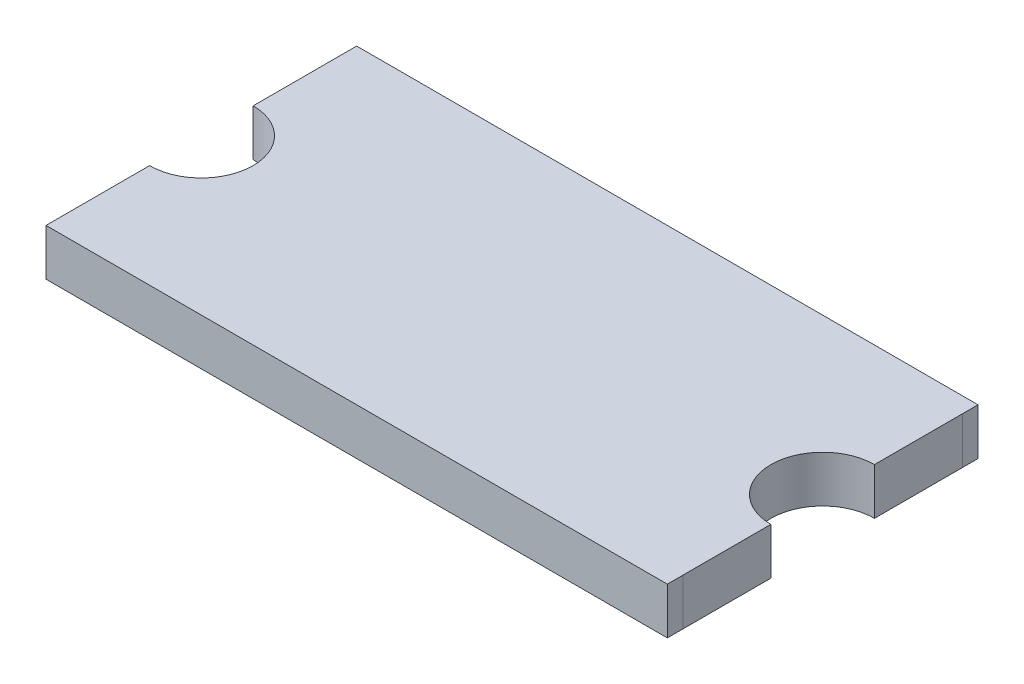
ISO-10303-21;
HEADER;
FILE_DESCRIPTION(('STEP AP214'),'2;1');
FILE_NAME('part.step','',(''),(''),'','','');
FILE_SCHEMA(('AUTOMOTIVE_DESIGN { 1 0 10303 214 1 1 1 1 }'));
ENDSEC;
DATA;
#1=APPLICATION_CONTEXT('core data for automotive mechanical design processes');
#2=APPLICATION_PROTOCOL_DEFINITION('international standard','automotive_design',2000,#1);
#3=PRODUCT_CONTEXT('',#1,'mechanical');
#4=PRODUCT('Part','Part','',(#3));
#5=PRODUCT_RELATED_PRODUCT_CATEGORY('part','',(#4));
#6=PRODUCT_DEFINITION_FORMATION('','',#4);
#7=PRODUCT_DEFINITION_CONTEXT('part definition',#1,'design');
#8=PRODUCT_DEFINITION('design','',#6,#7);
#9=PRODUCT_DEFINITION_SHAPE('','',#8);
#10=(LENGTH_UNIT() NAMED_UNIT(*) SI_UNIT(.MILLI.,.METRE.));
#11=(NAMED_UNIT(*) PLANE_ANGLE_UNIT() SI_UNIT($,.RADIAN.));
#12=(NAMED_UNIT(*) SI_UNIT($,.STERADIAN.) SOLID_ANGLE_UNIT());
#13=UNCERTAINTY_MEASURE_WITH_UNIT(LENGTH_MEASURE(1.E-05),#10,'distance_accuracy_value','');
#14=(GEOMETRIC_REPRESENTATION_CONTEXT(3) GLOBAL_UNCERTAINTY_ASSIGNED_CONTEXT((#13)) GLOBAL_UNIT_ASSIGNED_CONTEXT((#10,
#11,#12)) REPRESENTATION_CONTEXT('',''));
#15=CARTESIAN_POINT('',(0.,0.,0.));
#16=DIRECTION('',(0.,0.,1.));
#17=DIRECTION('',(1.,0.,0.));
#18=AXIS2_PLACEMENT_3D('',#15,#16,#17);
#19=CARTESIAN_POINT('',(0.,0.,0.));
#20=DIRECTION('',(0.,1.,0.));
#21=DIRECTION('',(1.,0.,0.));
#22=AXIS2_PLACEMENT_3D('',#19,#20,#21);
#23=PLANE('',#22);
#24=DIRECTION('',(0.,0.,1.));
#25=VECTOR('',#24,1.);
#26=CARTESIAN_POINT('',(0.,0.,0.1));
#27=LINE('',#26,#25);
#28=CARTESIAN_POINT('',(0.,0.,0.1));
#29=VERTEX_POINT('',#28);
#30=CARTESIAN_POINT('',(0.,0.,0.2));
#31=VERTEX_POINT('',#30);
#32=EDGE_CURVE('E333',#29,#31,#27,.T.);
#33=ORIENTED_EDGE('',*,*,#32,.T.);
#34=DIRECTION('',(-1.,0.,0.));
#35=VECTOR('',#34,1.);
#36=CARTESIAN_POINT('',(0.,0.,0.2));
#37=LINE('',#36,#35);
#38=CARTESIAN_POINT('',(-0.1,0.,0.2));
#39=VERTEX_POINT('',#38);
#40=EDGE_CURVE('E329',#31,#39,#37,.T.);
#41=ORIENTED_EDGE('',*,*,#40,.T.);
#42=DIRECTION('',(0.,0.,-1.));
#43=VECTOR('',#42,1.);
#44=CARTESIAN_POINT('',(-0.1,0.,0.2));
#45=LINE('',#44,#43);
#46=CARTESIAN_POINT('',(-0.1,0.,-0.2));
#47=VERTEX_POINT('',#46);
#48=EDGE_CURVE('E367',#39,#47,#45,.T.);
#49=ORIENTED_EDGE('',*,*,#48,.T.);
#50=DIRECTION('',(1.,0.,0.));
#51=VECTOR('',#50,1.);
#52=CARTESIAN_POINT('',(-0.1,0.,-0.2));
#53=LINE('',#52,#51);
#54=CARTESIAN_POINT('',(0.,0.,-0.2));
#55=VERTEX_POINT('',#54);
#56=EDGE_CURVE('E360',#47,#55,#53,.T.);
#57=ORIENTED_EDGE('',*,*,#56,.T.);
#58=DIRECTION('',(0.,0.,1.));
#59=VECTOR('',#58,1.);
#60=CARTESIAN_POINT('',(0.,0.,-0.2));
#61=LINE('',#60,#59);
#62=CARTESIAN_POINT('',(0.,0.,-0.1));
#63=VERTEX_POINT('',#62);
#64=EDGE_CURVE('E348',#55,#63,#61,.T.);
#65=ORIENTED_EDGE('',*,*,#64,.T.);
#66=DIRECTION('',(1.,0.,0.));
#67=VECTOR('',#66,1.);
#68=CARTESIAN_POINT('',(0.,0.,-0.1));
#69=LINE('',#68,#67);
#70=CARTESIAN_POINT('',(0.1,0.,-0.1));
#71=VERTEX_POINT('',#70);
#72=EDGE_CURVE('E345',#63,#71,#69,.T.);
#73=ORIENTED_EDGE('',*,*,#72,.T.);
#74=DIRECTION('',(0.,0.,1.));
#75=VECTOR('',#74,1.);
#76=CARTESIAN_POINT('',(0.1,0.,-0.1));
#77=LINE('',#76,#75);
#78=CARTESIAN_POINT('',(0.1,0.,0.1));
#79=VERTEX_POINT('',#78);
#80=EDGE_CURVE('E337',#71,#79,#77,.T.);
#81=ORIENTED_EDGE('',*,*,#80,.T.);
#82=DIRECTION('',(-1.,0.,0.));
#83=VECTOR('',#82,1.);
#84=CARTESIAN_POINT('',(0.1,0.,0.1));
#85=LINE('',#84,#83);
#86=EDGE_CURVE('E334',#79,#29,#85,.T.);
#87=ORIENTED_EDGE('',*,*,#86,.T.);
#88=EDGE_LOOP('',(#33,#41,#49,#57,#65,#73,#81,#87));
#89=FACE_BOUND('',#88,.T.);
#90=ADVANCED_FACE('F17',(#89),#23,.F.);
#91=CARTESIAN_POINT('',(0.,0.,0.));
#92=DIRECTION('',(0.,1.,0.));
#93=DIRECTION('',(1.,0.,0.));
#94=AXIS2_PLACEMENT_3D('',#91,#92,#93);
#95=PLANE('',#94);
#96=CARTESIAN_POINT('',(-0.500000810616883,0.,3.15918040491581E-06));
#97=DIRECTION('',(0.,-1.,0.));
#98=DIRECTION('',(0.481478331285645,0.,-0.876457994716456));
#99=AXIS2_PLACEMENT_3D('',#96,#97,#98);
#100=CIRCLE('',#99,0.225003159181865);
#101=CARTESIAN_POINT('',(-0.5,0.,-0.225));
#102=VERTEX_POINT('',#101);
#103=CARTESIAN_POINT('',(-0.391666665,0.,-0.197202658521));
#104=VERTEX_POINT('',#103);
#105=EDGE_CURVE('E379',#102,#104,#100,.T.);
#106=ORIENTED_EDGE('',*,*,#105,.F.);
#107=DIRECTION('',(0.,0.,1.));
#108=VECTOR('',#107,1.);
#109=CARTESIAN_POINT('',(-0.5,0.,-0.25));
#110=LINE('',#109,#108);
#111=CARTESIAN_POINT('',(-0.5,0.,-0.25));
#112=VERTEX_POINT('',#111);
#113=EDGE_CURVE('E11',#112,#102,#110,.T.);
#114=ORIENTED_EDGE('',*,*,#113,.F.);
#115=DIRECTION('',(-1.,0.,0.));
#116=VECTOR('',#115,1.);
#117=CARTESIAN_POINT('',(-0.391666665,0.,-0.25));
#118=LINE('',#117,#116);
#119=CARTESIAN_POINT('',(-0.391666665,0.,-0.25));
#120=VERTEX_POINT('',#119);
#121=EDGE_CURVE('E451',#120,#112,#118,.T.);
#122=ORIENTED_EDGE('',*,*,#121,.F.);
#123=DIRECTION('',(0.,0.,-1.));
#124=VECTOR('',#123,1.);
#125=CARTESIAN_POINT('',(-0.391666665,0.,-0.197202658521));
#126=LINE('',#125,#124);
#127=EDGE_CURVE('E357',#104,#120,#126,.T.);
#128=ORIENTED_EDGE('',*,*,#127,.F.);
#129=EDGE_LOOP('',(#106,#114,#122,#128));
#130=FACE_BOUND('',#129,.T.);
#131=ADVANCED_FACE('F740',(#130),#95,.F.);
#132=CARTESIAN_POINT('',(-0.5,0.075,0.25));
#133=DIRECTION('',(1.,0.,0.));
#134=DIRECTION('',(0.,1.,0.));
#135=AXIS2_PLACEMENT_3D('',#132,#133,#134);
#136=PLANE('',#135);
#137=DIRECTION('',(0.,-1.,0.));
#138=VECTOR('',#137,1.);
#139=CARTESIAN_POINT('',(-0.5,0.075,-0.225));
#140=LINE('',#139,#138);
#141=CARTESIAN_POINT('',(-0.5,0.075,-0.225));
#142=VERTEX_POINT('',#141);
#143=EDGE_CURVE('E25',#142,#102,#140,.T.);
#144=ORIENTED_EDGE('',*,*,#143,.F.);
#145=DIRECTION('',(0.,0.,1.));
#146=VECTOR('',#145,1.);
#147=CARTESIAN_POINT('',(-0.5,0.075,-0.25));
#148=LINE('',#147,#146);
#149=CARTESIAN_POINT('',(-0.5,0.075,-0.25));
#150=VERTEX_POINT('',#149);
#151=EDGE_CURVE('E349',#150,#142,#148,.T.);
#152=ORIENTED_EDGE('',*,*,#151,.F.);
#153=DIRECTION('',(0.,-1.,0.));
#154=VECTOR('',#153,1.);
#155=CARTESIAN_POINT('',(-0.5,0.075,-0.25));
#156=LINE('',#155,#154);
#157=EDGE_CURVE('E446',#150,#112,#156,.T.);
#158=ORIENTED_EDGE('',*,*,#157,.T.);
#159=ORIENTED_EDGE('',*,*,#113,.T.);
#160=EDGE_LOOP('',(#144,#152,#158,#159));
#161=FACE_BOUND('',#160,.T.);
#162=ADVANCED_FACE('F742',(#161),#136,.F.);
#163=CARTESIAN_POINT('',(-0.5,0.075,0.25));
#164=DIRECTION('',(1.,0.,0.));
#165=DIRECTION('',(0.,1.,0.));
#166=AXIS2_PLACEMENT_3D('',#163,#164,#165);
#167=PLANE('',#166);
#168=DIRECTION('',(0.,0.,1.));
#169=VECTOR('',#168,1.);
#170=CARTESIAN_POINT('',(-0.5,0.075,-0.225));
#171=LINE('',#170,#169);
#172=CARTESIAN_POINT('',(-0.5,0.075,-0.083333335));
#173=VERTEX_POINT('',#172);
#174=EDGE_CURVE('E353',#142,#173,#171,.T.);
#175=ORIENTED_EDGE('',*,*,#174,.F.);
#176=ORIENTED_EDGE('',*,*,#143,.T.);
#177=DIRECTION('',(0.,0.,1.));
#178=VECTOR('',#177,1.);
#179=CARTESIAN_POINT('',(-0.5,0.,-0.225));
#180=LINE('',#179,#178);
#181=CARTESIAN_POINT('',(-0.5,0.,-0.083333335));
#182=VERTEX_POINT('',#181);
#183=EDGE_CURVE('E319',#102,#182,#180,.T.);
#184=ORIENTED_EDGE('',*,*,#183,.T.);
#185=DIRECTION('',(0.,1.,0.));
#186=VECTOR('',#185,1.);
#187=CARTESIAN_POINT('',(-0.5,0.,-0.083333335));
#188=LINE('',#187,#186);
#189=EDGE_CURVE('E364',#182,#173,#188,.T.);
#190=ORIENTED_EDGE('',*,*,#189,.T.);
#191=EDGE_LOOP('',(#175,#176,#184,#190));
#192=FACE_BOUND('',#191,.T.);
#193=ADVANCED_FACE('F811',(#192),#167,.F.);
#194=CARTESIAN_POINT('',(-0.5,0.,0.));
#195=DIRECTION('',(0.,1.,0.));
#196=DIRECTION('',(0.,0.,1.));
#197=AXIS2_PLACEMENT_3D('',#194,#195,#196);
#198=CYLINDRICAL_SURFACE('',#197,0.083333335);
#199=CARTESIAN_POINT('',(-0.5,0.,0.));
#200=DIRECTION('',(0.,-1.,0.));
#201=DIRECTION('',(0.,0.,-1.));
#202=AXIS2_PLACEMENT_3D('',#199,#200,#201);
#203=CIRCLE('',#202,0.083333335);
#204=CARTESIAN_POINT('',(-0.5,0.,0.083333335));
#205=VERTEX_POINT('',#204);
#206=EDGE_CURVE('E315',#182,#205,#203,.T.);
#207=ORIENTED_EDGE('',*,*,#206,.T.);
#208=DIRECTION('',(0.,-1.,0.));
#209=VECTOR('',#208,1.);
#210=CARTESIAN_POINT('',(-0.5,0.075,0.083333335));
#211=LINE('',#210,#209);
#212=CARTESIAN_POINT('',(-0.5,0.075,0.083333335));
#213=VERTEX_POINT('',#212);
#214=EDGE_CURVE('E419',#213,#205,#211,.T.);
#215=ORIENTED_EDGE('',*,*,#214,.F.);
#216=CARTESIAN_POINT('',(-0.5,0.075,0.));
#217=DIRECTION('',(0.,1.,0.));
#218=DIRECTION('',(0.,0.,1.));
#219=AXIS2_PLACEMENT_3D('',#216,#217,#218);
#220=CIRCLE('',#219,0.083333335);
#221=EDGE_CURVE('E400',#213,#173,#220,.T.);
#222=ORIENTED_EDGE('',*,*,#221,.T.);
#223=ORIENTED_EDGE('',*,*,#189,.F.);
#224=EDGE_LOOP('',(#207,#215,#222,#223));
#225=FACE_BOUND('',#224,.T.);
#226=ADVANCED_FACE('F808',(#225),#198,.F.);
#227=CARTESIAN_POINT('',(-0.5,0.075,0.25));
#228=DIRECTION('',(1.,0.,0.));
#229=DIRECTION('',(0.,1.,0.));
#230=AXIS2_PLACEMENT_3D('',#227,#228,#229);
#231=PLANE('',#230);
#232=DIRECTION('',(0.,-1.,0.));
#233=VECTOR('',#232,1.);
#234=CARTESIAN_POINT('',(-0.5,0.075,0.225));
#235=LINE('',#234,#233);
#236=CARTESIAN_POINT('',(-0.5,0.075,0.225));
#237=VERTEX_POINT('',#236);
#238=CARTESIAN_POINT('',(-0.5,0.,0.225));
#239=VERTEX_POINT('',#238);
#240=EDGE_CURVE('E342',#237,#239,#235,.T.);
#241=ORIENTED_EDGE('',*,*,#240,.F.);
#242=DIRECTION('',(0.,0.,1.));
#243=VECTOR('',#242,1.);
#244=CARTESIAN_POINT('',(-0.5,0.075,0.083333335));
#245=LINE('',#244,#243);
#246=EDGE_CURVE('E314',#213,#237,#245,.T.);
#247=ORIENTED_EDGE('',*,*,#246,.F.);
#248=ORIENTED_EDGE('',*,*,#214,.T.);
#249=DIRECTION('',(0.,0.,1.));
#250=VECTOR('',#249,1.);
#251=CARTESIAN_POINT('',(-0.5,0.,0.083333335));
#252=LINE('',#251,#250);
#253=EDGE_CURVE('E320',#205,#239,#252,.T.);
#254=ORIENTED_EDGE('',*,*,#253,.T.);
#255=EDGE_LOOP('',(#241,#247,#248,#254));
#256=FACE_BOUND('',#255,.T.);
#257=ADVANCED_FACE('F800',(#256),#231,.F.);
#258=CARTESIAN_POINT('',(0.5,0.075,0.25));
#259=DIRECTION('',(-1.,0.,0.));
#260=DIRECTION('',(0.,0.,1.));
#261=AXIS2_PLACEMENT_3D('',#258,#259,#260);
#262=PLANE('',#261);
#263=DIRECTION('',(0.,1.,0.));
#264=VECTOR('',#263,1.);
#265=CARTESIAN_POINT('',(0.5,0.,-0.225));
#266=LINE('',#265,#264);
#267=CARTESIAN_POINT('',(0.5,0.,-0.225));
#268=VERTEX_POINT('',#267);
#269=CARTESIAN_POINT('',(0.5,0.075,-0.225));
#270=VERTEX_POINT('',#269);
#271=EDGE_CURVE('E417',#268,#270,#266,.T.);
#272=ORIENTED_EDGE('',*,*,#271,.F.);
#273=DIRECTION('',(0.,0.,-1.));
#274=VECTOR('',#273,1.);
#275=CARTESIAN_POINT('',(0.5,0.,-0.225));
#276=LINE('',#275,#274);
#277=CARTESIAN_POINT('',(0.5,0.,-0.25));
#278=VERTEX_POINT('',#277);
#279=EDGE_CURVE('E468',#268,#278,#276,.T.);
#280=ORIENTED_EDGE('',*,*,#279,.T.);
#281=DIRECTION('',(0.,-1.,0.));
#282=VECTOR('',#281,1.);
#283=CARTESIAN_POINT('',(0.5,0.075,-0.25));
#284=LINE('',#283,#282);
#285=CARTESIAN_POINT('',(0.5,0.075,-0.25));
#286=VERTEX_POINT('',#285);
#287=EDGE_CURVE('E469',#286,#278,#284,.T.);
#288=ORIENTED_EDGE('',*,*,#287,.F.);
#289=DIRECTION('',(0.,0.,-1.));
#290=VECTOR('',#289,1.);
#291=CARTESIAN_POINT('',(0.5,0.075,-0.225));
#292=LINE('',#291,#290);
#293=EDGE_CURVE('E354',#270,#286,#292,.T.);
#294=ORIENTED_EDGE('',*,*,#293,.F.);
#295=EDGE_LOOP('',(#272,#280,#288,#294));
#296=FACE_BOUND('',#295,.T.);
#297=ADVANCED_FACE('F744',(#296),#262,.F.);
#298=CARTESIAN_POINT('',(0.5,0.075,0.25));
#299=DIRECTION('',(-1.,0.,0.));
#300=DIRECTION('',(0.,0.,1.));
#301=AXIS2_PLACEMENT_3D('',#298,#299,#300);
#302=PLANE('',#301);
#303=DIRECTION('',(0.,0.,-1.));
#304=VECTOR('',#303,1.);
#305=CARTESIAN_POINT('',(0.5,0.,-0.083333335));
#306=LINE('',#305,#304);
#307=CARTESIAN_POINT('',(0.5,0.,-0.083333335));
#308=VERTEX_POINT('',#307);
#309=EDGE_CURVE('E464',#308,#268,#306,.T.);
#310=ORIENTED_EDGE('',*,*,#309,.T.);
#311=ORIENTED_EDGE('',*,*,#271,.T.);
#312=DIRECTION('',(0.,0.,-1.));
#313=VECTOR('',#312,1.);
#314=CARTESIAN_POINT('',(0.5,0.075,-0.083333335));
#315=LINE('',#314,#313);
#316=CARTESIAN_POINT('',(0.5,0.075,-0.083333335));
#317=VERTEX_POINT('',#316);
#318=EDGE_CURVE('E395',#317,#270,#315,.T.);
#319=ORIENTED_EDGE('',*,*,#318,.F.);
#320=DIRECTION('',(0.,-1.,0.));
#321=VECTOR('',#320,1.);
#322=CARTESIAN_POINT('',(0.5,0.075,-0.083333335));
#323=LINE('',#322,#321);
#324=EDGE_CURVE('E413',#317,#308,#323,.T.);
#325=ORIENTED_EDGE('',*,*,#324,.T.);
#326=EDGE_LOOP('',(#310,#311,#319,#325));
#327=FACE_BOUND('',#326,.T.);
#328=ADVANCED_FACE('F745',(#327),#302,.F.);
#329=CARTESIAN_POINT('',(0.5,0.075,0.25));
#330=DIRECTION('',(0.,0.,-1.));
#331=DIRECTION('',(0.,-1.,0.));
#332=AXIS2_PLACEMENT_3D('',#329,#330,#331);
#333=PLANE('',#332);
#334=DIRECTION('',(1.,0.,0.));
#335=VECTOR('',#334,1.);
#336=CARTESIAN_POINT('',(-0.5,0.,0.25));
#337=LINE('',#336,#335);
#338=CARTESIAN_POINT('',(-0.5,0.,0.25));
#339=VERTEX_POINT('',#338);
#340=CARTESIAN_POINT('',(-0.391666665,0.,0.25));
#341=VERTEX_POINT('',#340);
#342=EDGE_CURVE('E283',#339,#341,#337,.T.);
#343=ORIENTED_EDGE('',*,*,#342,.T.);
#344=DIRECTION('',(1.,0.,0.));
#345=VECTOR('',#344,1.);
#346=CARTESIAN_POINT('',(-0.391666665,0.,0.25));
#347=LINE('',#346,#345);
#348=CARTESIAN_POINT('',(-0.341666665,0.,0.25));
#349=VERTEX_POINT('',#348);
#350=EDGE_CURVE('E253',#341,#349,#347,.T.);
#351=ORIENTED_EDGE('',*,*,#350,.T.);
#352=DIRECTION('',(1.,0.,0.));
#353=VECTOR('',#352,1.);
#354=CARTESIAN_POINT('',(-0.341666665,0.,0.25));
#355=LINE('',#354,#353);
#356=CARTESIAN_POINT('',(0.341666665,0.,0.25));
#357=VERTEX_POINT('',#356);
#358=EDGE_CURVE('E246',#349,#357,#355,.T.);
#359=ORIENTED_EDGE('',*,*,#358,.T.);
#360=DIRECTION('',(1.,0.,0.));
#361=VECTOR('',#360,1.);
#362=CARTESIAN_POINT('',(0.341666665,0.,0.25));
#363=LINE('',#362,#361);
#364=CARTESIAN_POINT('',(0.391666665,0.,0.25));
#365=VERTEX_POINT('',#364);
#366=EDGE_CURVE('E250',#357,#365,#363,.T.);
#367=ORIENTED_EDGE('',*,*,#366,.T.);
#368=DIRECTION('',(1.,0.,0.));
#369=VECTOR('',#368,1.);
#370=CARTESIAN_POINT('',(0.391666665,0.,0.25));
#371=LINE('',#370,#369);
#372=CARTESIAN_POINT('',(0.5,0.,0.25));
#373=VERTEX_POINT('',#372);
#374=EDGE_CURVE('E37',#365,#373,#371,.T.);
#375=ORIENTED_EDGE('',*,*,#374,.T.);
#376=DIRECTION('',(0.,-1.,0.));
#377=VECTOR('',#376,1.);
#378=CARTESIAN_POINT('',(0.5,0.075,0.25));
#379=LINE('',#378,#377);
#380=CARTESIAN_POINT('',(0.5,0.075,0.25));
#381=VERTEX_POINT('',#380);
#382=EDGE_CURVE('E297',#381,#373,#379,.T.);
#383=ORIENTED_EDGE('',*,*,#382,.F.);
#384=DIRECTION('',(1.,0.,0.));
#385=VECTOR('',#384,1.);
#386=CARTESIAN_POINT('',(-0.5,0.075,0.25));
#387=LINE('',#386,#385);
#388=CARTESIAN_POINT('',(-0.5,0.075,0.25));
#389=VERTEX_POINT('',#388);
#390=EDGE_CURVE('E309',#389,#381,#387,.T.);
#391=ORIENTED_EDGE('',*,*,#390,.F.);
#392=DIRECTION('',(0.,-1.,0.));
#393=VECTOR('',#392,1.);
#394=CARTESIAN_POINT('',(-0.5,0.075,0.25));
#395=LINE('',#394,#393);
#396=EDGE_CURVE('E392',#389,#339,#395,.T.);
#397=ORIENTED_EDGE('',*,*,#396,.T.);
#398=EDGE_LOOP('',(#343,#351,#359,#367,#375,#383,#391,#397));
#399=FACE_BOUND('',#398,.T.);
#400=ADVANCED_FACE('F248',(#399),#333,.F.);
#401=CARTESIAN_POINT('',(0.,0.,0.));
#402=DIRECTION('',(0.,1.,0.));
#403=DIRECTION('',(1.,0.,0.));
#404=AXIS2_PLACEMENT_3D('',#401,#402,#403);
#405=PLANE('',#404);
#406=DIRECTION('',(0.,0.,1.));
#407=VECTOR('',#406,1.);
#408=CARTESIAN_POINT('',(0.391666665,0.,0.197202658521));
#409=LINE('',#408,#407);
#410=CARTESIAN_POINT('',(0.391666665,0.,0.197202658521));
#411=VERTEX_POINT('',#410);
#412=EDGE_CURVE('E271',#411,#365,#409,.T.);
#413=ORIENTED_EDGE('',*,*,#412,.F.);
#414=CARTESIAN_POINT('',(0.500000810616883,0.,-3.15918040491581E-06));
#415=DIRECTION('',(0.,-1.,0.));
#416=DIRECTION('',(-0.481478331285645,0.,0.876457994716456));
#417=AXIS2_PLACEMENT_3D('',#414,#415,#416);
#418=CIRCLE('',#417,0.225003159181865);
#419=CARTESIAN_POINT('',(0.5,0.,0.225));
#420=VERTEX_POINT('',#419);
#421=EDGE_CURVE('E278',#420,#411,#418,.T.);
#422=ORIENTED_EDGE('',*,*,#421,.F.);
#423=DIRECTION('',(0.,0.,-1.));
#424=VECTOR('',#423,1.);
#425=CARTESIAN_POINT('',(0.5,0.,0.25));
#426=LINE('',#425,#424);
#427=EDGE_CURVE('E300',#373,#420,#426,.T.);
#428=ORIENTED_EDGE('',*,*,#427,.F.);
#429=ORIENTED_EDGE('',*,*,#374,.F.);
#430=EDGE_LOOP('',(#413,#422,#428,#429));
#431=FACE_BOUND('',#430,.T.);
#432=ADVANCED_FACE('F512',(#431),#405,.F.);
#433=CARTESIAN_POINT('',(0.5,0.075,0.25));
#434=DIRECTION('',(-1.,0.,0.));
#435=DIRECTION('',(0.,0.,1.));
#436=AXIS2_PLACEMENT_3D('',#433,#434,#435);
#437=PLANE('',#436);
#438=ORIENTED_EDGE('',*,*,#427,.T.);
#439=DIRECTION('',(0.,1.,0.));
#440=VECTOR('',#439,1.);
#441=CARTESIAN_POINT('',(0.5,0.,0.225));
#442=LINE('',#441,#440);
#443=CARTESIAN_POINT('',(0.5,0.075,0.225));
#444=VERTEX_POINT('',#443);
#445=EDGE_CURVE('E47',#420,#444,#442,.T.);
#446=ORIENTED_EDGE('',*,*,#445,.T.);
#447=DIRECTION('',(0.,0.,-1.));
#448=VECTOR('',#447,1.);
#449=CARTESIAN_POINT('',(0.5,0.075,0.25));
#450=LINE('',#449,#448);
#451=EDGE_CURVE('E313',#381,#444,#450,.T.);
#452=ORIENTED_EDGE('',*,*,#451,.F.);
#453=ORIENTED_EDGE('',*,*,#382,.T.);
#454=EDGE_LOOP('',(#438,#446,#452,#453));
#455=FACE_BOUND('',#454,.T.);
#456=ADVANCED_FACE('F508',(#455),#437,.F.);
#457=CARTESIAN_POINT('',(0.5,0.075,0.25));
#458=DIRECTION('',(-1.,0.,0.));
#459=DIRECTION('',(0.,0.,1.));
#460=AXIS2_PLACEMENT_3D('',#457,#458,#459);
#461=PLANE('',#460);
#462=ORIENTED_EDGE('',*,*,#445,.F.);
#463=DIRECTION('',(0.,0.,-1.));
#464=VECTOR('',#463,1.);
#465=CARTESIAN_POINT('',(0.5,0.,0.225));
#466=LINE('',#465,#464);
#467=CARTESIAN_POINT('',(0.5,0.,0.083333335));
#468=VERTEX_POINT('',#467);
#469=EDGE_CURVE('E498',#420,#468,#466,.T.);
#470=ORIENTED_EDGE('',*,*,#469,.T.);
#471=DIRECTION('',(0.,1.,0.));
#472=VECTOR('',#471,1.);
#473=CARTESIAN_POINT('',(0.5,0.,0.083333335));
#474=LINE('',#473,#472);
#475=CARTESIAN_POINT('',(0.5,0.075,0.083333335));
#476=VERTEX_POINT('',#475);
#477=EDGE_CURVE('E408',#468,#476,#474,.T.);
#478=ORIENTED_EDGE('',*,*,#477,.T.);
#479=DIRECTION('',(0.,0.,-1.));
#480=VECTOR('',#479,1.);
#481=CARTESIAN_POINT('',(0.5,0.075,0.225));
#482=LINE('',#481,#480);
#483=EDGE_CURVE('E409',#444,#476,#482,.T.);
#484=ORIENTED_EDGE('',*,*,#483,.F.);
#485=EDGE_LOOP('',(#462,#470,#478,#484));
#486=FACE_BOUND('',#485,.T.);
#487=ADVANCED_FACE('F518',(#486),#461,.F.);
#488=CARTESIAN_POINT('',(0.5,0.,0.));
#489=DIRECTION('',(0.,1.,0.));
#490=DIRECTION('',(0.,0.,1.));
#491=AXIS2_PLACEMENT_3D('',#488,#489,#490);
#492=CYLINDRICAL_SURFACE('',#491,0.083333335);
#493=CARTESIAN_POINT('',(0.5,0.,0.));
#494=DIRECTION('',(0.,-1.,0.));
#495=DIRECTION('',(0.,0.,1.));
#496=AXIS2_PLACEMENT_3D('',#493,#494,#495);
#497=CIRCLE('',#496,0.083333335);
#498=EDGE_CURVE('E467',#468,#308,#497,.T.);
#499=ORIENTED_EDGE('',*,*,#498,.T.);
#500=ORIENTED_EDGE('',*,*,#324,.F.);
#501=CARTESIAN_POINT('',(0.5,0.075,0.));
#502=DIRECTION('',(0.,1.,0.));
#503=DIRECTION('',(0.,0.,-1.));
#504=AXIS2_PLACEMENT_3D('',#501,#502,#503);
#505=CIRCLE('',#504,0.083333335);
#506=EDGE_CURVE('E396',#317,#476,#505,.T.);
#507=ORIENTED_EDGE('',*,*,#506,.T.);
#508=ORIENTED_EDGE('',*,*,#477,.F.);
#509=EDGE_LOOP('',(#499,#500,#507,#508));
#510=FACE_BOUND('',#509,.T.);
#511=ADVANCED_FACE('F746',(#510),#492,.F.);
#512=CARTESIAN_POINT('',(0.,0.075,0.));
#513=DIRECTION('',(0.,1.,0.));
#514=DIRECTION('',(1.,0.,0.));
#515=AXIS2_PLACEMENT_3D('',#512,#513,#514);
#516=PLANE('',#515);
#517=ORIENTED_EDGE('',*,*,#506,.F.);
#518=ORIENTED_EDGE('',*,*,#318,.T.);
#519=ORIENTED_EDGE('',*,*,#293,.T.);
#520=DIRECTION('',(-1.,0.,0.));
#521=VECTOR('',#520,1.);
#522=CARTESIAN_POINT('',(0.5,0.075,-0.25));
#523=LINE('',#522,#521);
#524=EDGE_CURVE('E450',#286,#150,#523,.T.);
#525=ORIENTED_EDGE('',*,*,#524,.T.);
#526=ORIENTED_EDGE('',*,*,#151,.T.);
#527=ORIENTED_EDGE('',*,*,#174,.T.);
#528=ORIENTED_EDGE('',*,*,#221,.F.);
#529=ORIENTED_EDGE('',*,*,#246,.T.);
#530=DIRECTION('',(0.,0.,1.));
#531=VECTOR('',#530,1.);
#532=CARTESIAN_POINT('',(-0.5,0.075,0.225));
#533=LINE('',#532,#531);
#534=EDGE_CURVE('E338',#237,#389,#533,.T.);
#535=ORIENTED_EDGE('',*,*,#534,.T.);
#536=ORIENTED_EDGE('',*,*,#390,.T.);
#537=ORIENTED_EDGE('',*,*,#451,.T.);
#538=ORIENTED_EDGE('',*,*,#483,.T.);
#539=EDGE_LOOP('',(#517,#518,#519,#525,#526,#527,#528,#529,#535,#536,#537,#538));
#540=FACE_BOUND('',#539,.T.);
#541=ADVANCED_FACE('F507',(#540),#516,.T.);
#542=CARTESIAN_POINT('',(-0.5,0.075,0.25));
#543=DIRECTION('',(1.,0.,0.));
#544=DIRECTION('',(0.,1.,0.));
#545=AXIS2_PLACEMENT_3D('',#542,#543,#544);
#546=PLANE('',#545);
#547=ORIENTED_EDGE('',*,*,#534,.F.);
#548=ORIENTED_EDGE('',*,*,#240,.T.);
#549=DIRECTION('',(0.,0.,1.));
#550=VECTOR('',#549,1.);
#551=CARTESIAN_POINT('',(-0.5,0.,0.225));
#552=LINE('',#551,#550);
#553=EDGE_CURVE('E285',#239,#339,#552,.T.);
#554=ORIENTED_EDGE('',*,*,#553,.T.);
#555=ORIENTED_EDGE('',*,*,#396,.F.);
#556=EDGE_LOOP('',(#547,#548,#554,#555));
#557=FACE_BOUND('',#556,.T.);
#558=ADVANCED_FACE('F755',(#557),#546,.F.);
#559=CARTESIAN_POINT('',(0.,0.,0.));
#560=DIRECTION('',(0.,1.,0.));
#561=DIRECTION('',(1.,0.,0.));
#562=AXIS2_PLACEMENT_3D('',#559,#560,#561);
#563=PLANE('',#562);
#564=CARTESIAN_POINT('',(-0.500000810616883,0.,-3.15918040453417E-06));
#565=DIRECTION('',(0.,-1.,0.));
#566=DIRECTION('',(3.60269111533707E-06,0.,0.99999999999351));
#567=AXIS2_PLACEMENT_3D('',#564,#565,#566);
#568=CIRCLE('',#567,0.225003159181865);
#569=CARTESIAN_POINT('',(-0.391666665,0.,0.197202658521));
#570=VERTEX_POINT('',#569);
#571=EDGE_CURVE('E372',#570,#239,#568,.T.);
#572=ORIENTED_EDGE('',*,*,#571,.F.);
#573=DIRECTION('',(0.,0.,-1.));
#574=VECTOR('',#573,1.);
#575=CARTESIAN_POINT('',(-0.391666665,0.,0.25));
#576=LINE('',#575,#574);
#577=EDGE_CURVE('E368',#341,#570,#576,.T.);
#578=ORIENTED_EDGE('',*,*,#577,.F.);
#579=ORIENTED_EDGE('',*,*,#342,.F.);
#580=ORIENTED_EDGE('',*,*,#553,.F.);
#581=EDGE_LOOP('',(#572,#578,#579,#580));
#582=FACE_BOUND('',#581,.T.);
#583=ADVANCED_FACE('F784',(#582),#563,.F.);
#584=CARTESIAN_POINT('',(0.,0.,0.));
#585=DIRECTION('',(0.,1.,0.));
#586=DIRECTION('',(1.,0.,0.));
#587=AXIS2_PLACEMENT_3D('',#584,#585,#586);
#588=PLANE('',#587);
#589=ORIENTED_EDGE('',*,*,#577,.T.);
#590=ORIENTED_EDGE('',*,*,#571,.T.);
#591=ORIENTED_EDGE('',*,*,#253,.F.);
#592=ORIENTED_EDGE('',*,*,#206,.F.);
#593=ORIENTED_EDGE('',*,*,#183,.F.);
#594=ORIENTED_EDGE('',*,*,#105,.T.);
#595=ORIENTED_EDGE('',*,*,#127,.T.);
#596=DIRECTION('',(-1.,0.,0.));
#597=VECTOR('',#596,1.);
#598=CARTESIAN_POINT('',(-0.341666665,0.,-0.25));
#599=LINE('',#598,#597);
#600=CARTESIAN_POINT('',(-0.341666665,0.,-0.25));
#601=VERTEX_POINT('',#600);
#602=EDGE_CURVE('E457',#601,#120,#599,.T.);
#603=ORIENTED_EDGE('',*,*,#602,.F.);
#604=DIRECTION('',(0.,0.,1.));
#605=VECTOR('',#604,1.);
#606=CARTESIAN_POINT('',(-0.341666665,0.,-0.25));
#607=LINE('',#606,#605);
#608=CARTESIAN_POINT('',(-0.341666665,0.,-0.225));
#609=VERTEX_POINT('',#608);
#610=EDGE_CURVE('E326',#601,#609,#607,.T.);
#611=ORIENTED_EDGE('',*,*,#610,.T.);
#612=DIRECTION('',(1.,0.,0.));
#613=VECTOR('',#612,1.);
#614=CARTESIAN_POINT('',(-0.341666665,0.,-0.225));
#615=LINE('',#614,#613);
#616=CARTESIAN_POINT('',(-0.2,0.,-0.225));
#617=VERTEX_POINT('',#616);
#618=EDGE_CURVE('E323',#609,#617,#615,.T.);
#619=ORIENTED_EDGE('',*,*,#618,.T.);
#620=DIRECTION('',(0.,0.,1.));
#621=VECTOR('',#620,1.);
#622=CARTESIAN_POINT('',(-0.2,0.,-0.225));
#623=LINE('',#622,#621);
#624=CARTESIAN_POINT('',(-0.2,0.,0.225));
#625=VERTEX_POINT('',#624);
#626=EDGE_CURVE('E308',#617,#625,#623,.T.);
#627=ORIENTED_EDGE('',*,*,#626,.T.);
#628=DIRECTION('',(-1.,0.,0.));
#629=VECTOR('',#628,1.);
#630=CARTESIAN_POINT('',(-0.2,0.,0.225));
#631=LINE('',#630,#629);
#632=CARTESIAN_POINT('',(-0.341666665,0.,0.225));
#633=VERTEX_POINT('',#632);
#634=EDGE_CURVE('E305',#625,#633,#631,.T.);
#635=ORIENTED_EDGE('',*,*,#634,.T.);
#636=DIRECTION('',(0.,0.,1.));
#637=VECTOR('',#636,1.);
#638=CARTESIAN_POINT('',(-0.341666665,0.,0.225));
#639=LINE('',#638,#637);
#640=EDGE_CURVE('E258',#633,#349,#639,.T.);
#641=ORIENTED_EDGE('',*,*,#640,.T.);
#642=ORIENTED_EDGE('',*,*,#350,.F.);
#643=EDGE_LOOP('',(#589,#590,#591,#592,#593,#594,#595,#603,#611,#619,#627,#635,#641,#642));
#644=FACE_BOUND('',#643,.T.);
#645=ADVANCED_FACE('F736',(#644),#588,.F.);
#646=CARTESIAN_POINT('',(0.,0.,0.));
#647=DIRECTION('',(0.,1.,0.));
#648=DIRECTION('',(1.,0.,0.));
#649=AXIS2_PLACEMENT_3D('',#646,#647,#648);
#650=PLANE('',#649);
#651=ORIENTED_EDGE('',*,*,#40,.F.);
#652=ORIENTED_EDGE('',*,*,#32,.F.);
#653=ORIENTED_EDGE('',*,*,#86,.F.);
#654=ORIENTED_EDGE('',*,*,#80,.F.);
#655=ORIENTED_EDGE('',*,*,#72,.F.);
#656=ORIENTED_EDGE('',*,*,#64,.F.);
#657=ORIENTED_EDGE('',*,*,#56,.F.);
#658=ORIENTED_EDGE('',*,*,#48,.F.);
#659=EDGE_LOOP('',(#651,#652,#653,#654,#655,#656,#657,#658));
#660=FACE_BOUND('',#659,.T.);
#661=DIRECTION('',(0.,0.,-1.));
#662=VECTOR('',#661,1.);
#663=CARTESIAN_POINT('',(0.341666665,0.,-0.225));
#664=LINE('',#663,#662);
#665=CARTESIAN_POINT('',(0.341666665,0.,-0.225));
#666=VERTEX_POINT('',#665);
#667=CARTESIAN_POINT('',(0.341666665,0.,-0.25));
#668=VERTEX_POINT('',#667);
#669=EDGE_CURVE('E259',#666,#668,#664,.T.);
#670=ORIENTED_EDGE('',*,*,#669,.F.);
#671=DIRECTION('',(1.,0.,0.));
#672=VECTOR('',#671,1.);
#673=CARTESIAN_POINT('',(0.2,0.,-0.225));
#674=LINE('',#673,#672);
#675=CARTESIAN_POINT('',(0.2,0.,-0.225));
#676=VERTEX_POINT('',#675);
#677=EDGE_CURVE('E293',#676,#666,#674,.T.);
#678=ORIENTED_EDGE('',*,*,#677,.F.);
#679=DIRECTION('',(0.,0.,-1.));
#680=VECTOR('',#679,1.);
#681=CARTESIAN_POINT('',(0.2,0.,0.225));
#682=LINE('',#681,#680);
#683=CARTESIAN_POINT('',(0.2,0.,0.225));
#684=VERTEX_POINT('',#683);
#685=EDGE_CURVE('E289',#684,#676,#682,.T.);
#686=ORIENTED_EDGE('',*,*,#685,.F.);
#687=DIRECTION('',(-1.,0.,0.));
#688=VECTOR('',#687,1.);
#689=CARTESIAN_POINT('',(0.341666665,0.,0.225));
#690=LINE('',#689,#688);
#691=CARTESIAN_POINT('',(0.341666665,0.,0.225));
#692=VERTEX_POINT('',#691);
#693=EDGE_CURVE('E265',#692,#684,#690,.T.);
#694=ORIENTED_EDGE('',*,*,#693,.F.);
#695=DIRECTION('',(0.,0.,-1.));
#696=VECTOR('',#695,1.);
#697=CARTESIAN_POINT('',(0.341666665,0.,0.25));
#698=LINE('',#697,#696);
#699=EDGE_CURVE('E262',#357,#692,#698,.T.);
#700=ORIENTED_EDGE('',*,*,#699,.F.);
#701=ORIENTED_EDGE('',*,*,#358,.F.);
#702=ORIENTED_EDGE('',*,*,#640,.F.);
#703=ORIENTED_EDGE('',*,*,#634,.F.);
#704=ORIENTED_EDGE('',*,*,#626,.F.);
#705=ORIENTED_EDGE('',*,*,#618,.F.);
#706=ORIENTED_EDGE('',*,*,#610,.F.);
#707=DIRECTION('',(-1.,0.,0.));
#708=VECTOR('',#707,1.);
#709=CARTESIAN_POINT('',(0.341666665,0.,-0.25));
#710=LINE('',#709,#708);
#711=EDGE_CURVE('E445',#668,#601,#710,.T.);
#712=ORIENTED_EDGE('',*,*,#711,.F.);
#713=EDGE_LOOP('',(#670,#678,#686,#694,#700,#701,#702,#703,#704,#705,#706,#712));
#714=FACE_BOUND('',#713,.T.);
#715=ADVANCED_FACE('F263',(#660,#714),#650,.F.);
#716=CARTESIAN_POINT('',(0.,0.,0.));
#717=DIRECTION('',(0.,1.,0.));
#718=DIRECTION('',(1.,0.,0.));
#719=AXIS2_PLACEMENT_3D('',#716,#717,#718);
#720=PLANE('',#719);
#721=DIRECTION('',(0.,0.,1.));
#722=VECTOR('',#721,1.);
#723=CARTESIAN_POINT('',(0.391666665,0.,-0.25));
#724=LINE('',#723,#722);
#725=CARTESIAN_POINT('',(0.391666665,0.,-0.25));
#726=VERTEX_POINT('',#725);
#727=CARTESIAN_POINT('',(0.391666665,0.,-0.197202658521));
#728=VERTEX_POINT('',#727);
#729=EDGE_CURVE('E484',#726,#728,#724,.T.);
#730=ORIENTED_EDGE('',*,*,#729,.T.);
#731=CARTESIAN_POINT('',(0.500000810616883,0.,3.15918040453417E-06));
#732=DIRECTION('',(0.,-1.,0.));
#733=DIRECTION('',(-3.60269111533707E-06,0.,-0.99999999999351));
#734=AXIS2_PLACEMENT_3D('',#731,#732,#733);
#735=CIRCLE('',#734,0.225003159181865);
#736=EDGE_CURVE('E473',#728,#268,#735,.T.);
#737=ORIENTED_EDGE('',*,*,#736,.T.);
#738=ORIENTED_EDGE('',*,*,#309,.F.);
#739=ORIENTED_EDGE('',*,*,#498,.F.);
#740=ORIENTED_EDGE('',*,*,#469,.F.);
#741=ORIENTED_EDGE('',*,*,#421,.T.);
#742=ORIENTED_EDGE('',*,*,#412,.T.);
#743=ORIENTED_EDGE('',*,*,#366,.F.);
#744=ORIENTED_EDGE('',*,*,#699,.T.);
#745=ORIENTED_EDGE('',*,*,#693,.T.);
#746=ORIENTED_EDGE('',*,*,#685,.T.);
#747=ORIENTED_EDGE('',*,*,#677,.T.);
#748=ORIENTED_EDGE('',*,*,#669,.T.);
#749=DIRECTION('',(-1.,0.,0.));
#750=VECTOR('',#749,1.);
#751=CARTESIAN_POINT('',(0.391666665,0.,-0.25));
#752=LINE('',#751,#750);
#753=EDGE_CURVE('E441',#726,#668,#752,.T.);
#754=ORIENTED_EDGE('',*,*,#753,.F.);
#755=EDGE_LOOP('',(#730,#737,#738,#739,#740,#741,#742,#743,#744,#745,#746,#747,#748,#754));
#756=FACE_BOUND('',#755,.T.);
#757=ADVANCED_FACE('F269',(#756),#720,.F.);
#758=CARTESIAN_POINT('',(0.,0.,0.));
#759=DIRECTION('',(0.,1.,0.));
#760=DIRECTION('',(1.,0.,0.));
#761=AXIS2_PLACEMENT_3D('',#758,#759,#760);
#762=PLANE('',#761);
#763=ORIENTED_EDGE('',*,*,#736,.F.);
#764=ORIENTED_EDGE('',*,*,#729,.F.);
#765=DIRECTION('',(-1.,0.,0.));
#766=VECTOR('',#765,1.);
#767=CARTESIAN_POINT('',(0.5,0.,-0.25));
#768=LINE('',#767,#766);
#769=EDGE_CURVE('E437',#278,#726,#768,.T.);
#770=ORIENTED_EDGE('',*,*,#769,.F.);
#771=ORIENTED_EDGE('',*,*,#279,.F.);
#772=EDGE_LOOP('',(#763,#764,#770,#771));
#773=FACE_BOUND('',#772,.T.);
#774=ADVANCED_FACE('F729',(#773),#762,.F.);
#775=CARTESIAN_POINT('',(0.5,0.075,-0.25));
#776=DIRECTION('',(0.,0.,1.));
#777=DIRECTION('',(1.,0.,0.));
#778=AXIS2_PLACEMENT_3D('',#775,#776,#777);
#779=PLANE('',#778);
#780=ORIENTED_EDGE('',*,*,#769,.T.);
#781=ORIENTED_EDGE('',*,*,#753,.T.);
#782=ORIENTED_EDGE('',*,*,#711,.T.);
#783=ORIENTED_EDGE('',*,*,#602,.T.);
#784=ORIENTED_EDGE('',*,*,#121,.T.);
#785=ORIENTED_EDGE('',*,*,#157,.F.);
#786=ORIENTED_EDGE('',*,*,#524,.F.);
#787=ORIENTED_EDGE('',*,*,#287,.T.);
#788=EDGE_LOOP('',(#780,#781,#782,#783,#784,#785,#786,#787));
#789=FACE_BOUND('',#788,.T.);
#790=ADVANCED_FACE('F722',(#789),#779,.F.);
#791=CLOSED_SHELL('',(#90,#131,#162,#193,#226,#257,#297,#328,#400,#432,#456,#487,#511,#541,#558,
#583,#645,#715,#757,#774,#790));
#792=MANIFOLD_SOLID_BREP('B1',#791);
#793=ADVANCED_BREP_SHAPE_REPRESENTATION('',(#18,#792),#14);
#794=SHAPE_DEFINITION_REPRESENTATION(#9,#793);
ENDSEC;
END-ISO-10303-21;
